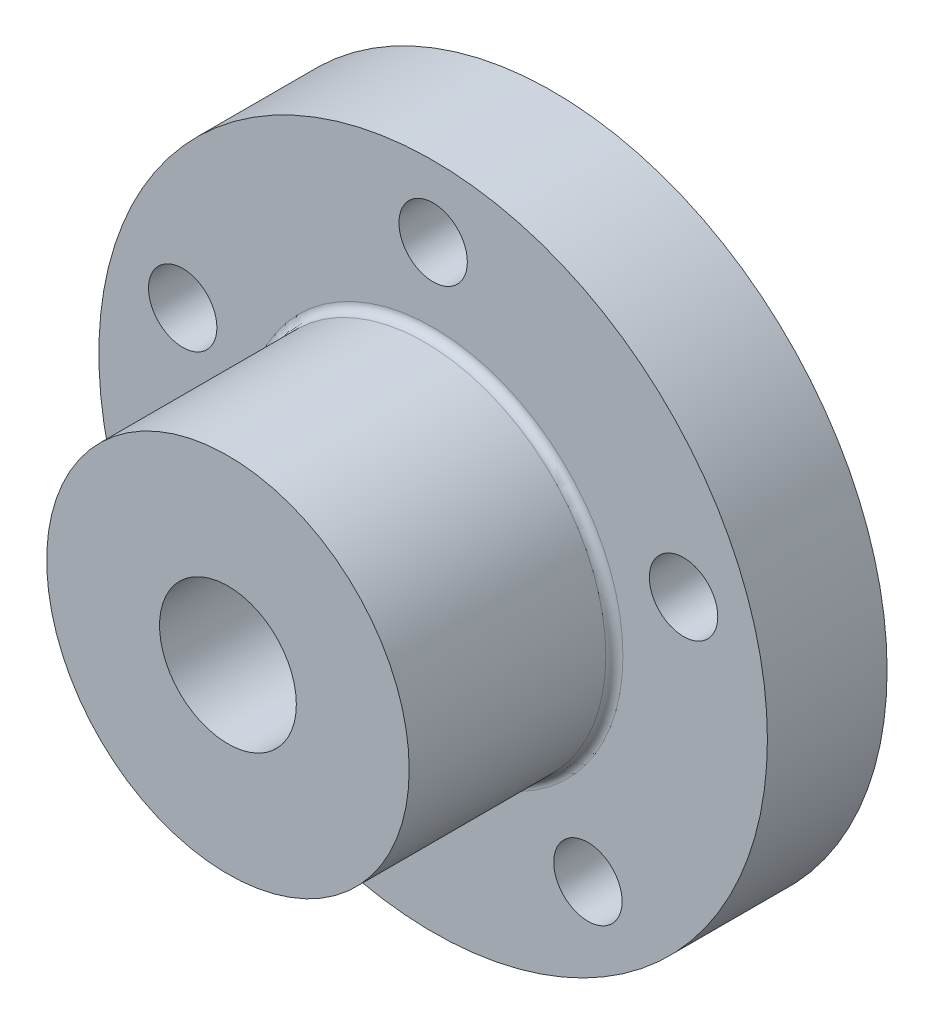
ISO-10303-21;
HEADER;
FILE_DESCRIPTION(('STEP AP214'),'2;1');
FILE_NAME('part.step','',(''),(''),'','','');
FILE_SCHEMA(('AUTOMOTIVE_DESIGN { 1 0 10303 214 1 1 1 1 }'));
ENDSEC;
DATA;
#1=APPLICATION_CONTEXT('core data for automotive mechanical design processes');
#2=APPLICATION_PROTOCOL_DEFINITION('international standard','automotive_design',2000,#1);
#3=PRODUCT_CONTEXT('',#1,'mechanical');
#4=PRODUCT('Part','Part','',(#3));
#5=PRODUCT_RELATED_PRODUCT_CATEGORY('part','',(#4));
#6=PRODUCT_DEFINITION_FORMATION('','',#4);
#7=PRODUCT_DEFINITION_CONTEXT('part definition',#1,'design');
#8=PRODUCT_DEFINITION('design','',#6,#7);
#9=PRODUCT_DEFINITION_SHAPE('','',#8);
#10=(LENGTH_UNIT() NAMED_UNIT(*) SI_UNIT(.MILLI.,.METRE.));
#11=(NAMED_UNIT(*) PLANE_ANGLE_UNIT() SI_UNIT($,.RADIAN.));
#12=(NAMED_UNIT(*) SI_UNIT($,.STERADIAN.) SOLID_ANGLE_UNIT());
#13=UNCERTAINTY_MEASURE_WITH_UNIT(LENGTH_MEASURE(1.E-05),#10,'distance_accuracy_value','');
#14=(GEOMETRIC_REPRESENTATION_CONTEXT(3) GLOBAL_UNCERTAINTY_ASSIGNED_CONTEXT((#13)) GLOBAL_UNIT_ASSIGNED_CONTEXT((#10,
#11,#12)) REPRESENTATION_CONTEXT('',''));
#15=CARTESIAN_POINT('',(0.,0.,0.));
#16=DIRECTION('',(0.,0.,1.));
#17=DIRECTION('',(1.,0.,0.));
#18=AXIS2_PLACEMENT_3D('',#15,#16,#17);
#19=CARTESIAN_POINT('',(0.,0.,7.));
#20=DIRECTION('',(0.,0.,1.));
#21=DIRECTION('',(1.,0.,0.));
#22=AXIS2_PLACEMENT_3D('',#19,#20,#21);
#23=PLANE('',#22);
#24=CARTESIAN_POINT('',(-14.6462703509452,4.75886171337398,7.));
#25=DIRECTION('',(0.,0.,1.));
#26=DIRECTION('',(1.,0.,0.));
#27=AXIS2_PLACEMENT_3D('',#24,#25,#26);
#28=CIRCLE('',#27,2.00000000000056);
#29=CARTESIAN_POINT('',(-12.6462703509446,4.75886171337398,7.));
#30=VERTEX_POINT('',#29);
#31=EDGE_CURVE('E84',#30,#30,#28,.T.);
#32=ORIENTED_EDGE('',*,*,#31,.F.);
#33=EDGE_LOOP('',(#32));
#34=FACE_BOUND('',#33,.T.);
#35=CARTESIAN_POINT('',(-9.05189288530368,-12.4588617133743,7.));
#36=DIRECTION('',(0.,0.,1.));
#37=DIRECTION('',(1.,0.,0.));
#38=AXIS2_PLACEMENT_3D('',#35,#36,#37);
#39=CIRCLE('',#38,2.00000000000056);
#40=CARTESIAN_POINT('',(-7.05189288530312,-12.4588617133743,7.));
#41=VERTEX_POINT('',#40);
#42=EDGE_CURVE('E78',#41,#41,#39,.T.);
#43=ORIENTED_EDGE('',*,*,#42,.F.);
#44=EDGE_LOOP('',(#43));
#45=FACE_BOUND('',#44,.T.);
#46=CARTESIAN_POINT('',(9.0518928853045,-12.4588617133741,7.));
#47=DIRECTION('',(0.,0.,1.));
#48=DIRECTION('',(1.,0.,0.));
#49=AXIS2_PLACEMENT_3D('',#46,#47,#48);
#50=CIRCLE('',#49,2.00000000000056);
#51=CARTESIAN_POINT('',(11.0518928853051,-12.4588617133741,7.));
#52=VERTEX_POINT('',#51);
#53=EDGE_CURVE('E72',#52,#52,#50,.T.);
#54=ORIENTED_EDGE('',*,*,#53,.F.);
#55=EDGE_LOOP('',(#54));
#56=FACE_BOUND('',#55,.T.);
#57=CARTESIAN_POINT('',(14.6462703509455,4.75886171337441,7.));
#58=DIRECTION('',(0.,0.,1.));
#59=DIRECTION('',(1.,0.,0.));
#60=AXIS2_PLACEMENT_3D('',#57,#58,#59);
#61=CIRCLE('',#60,2.00000000000057);
#62=CARTESIAN_POINT('',(16.6462703509461,4.75886171337441,7.));
#63=VERTEX_POINT('',#62);
#64=EDGE_CURVE('E66',#63,#63,#61,.T.);
#65=ORIENTED_EDGE('',*,*,#64,.F.);
#66=EDGE_LOOP('',(#65));
#67=FACE_BOUND('',#66,.T.);
#68=CARTESIAN_POINT('',(0.,15.4,7.));
#69=DIRECTION('',(0.,0.,1.));
#70=DIRECTION('',(1.,0.,0.));
#71=AXIS2_PLACEMENT_3D('',#68,#69,#70);
#72=CIRCLE('',#71,2.00000000000056);
#73=CARTESIAN_POINT('',(2.00000000000056,15.4,7.));
#74=VERTEX_POINT('',#73);
#75=EDGE_CURVE('E60',#74,#74,#72,.T.);
#76=ORIENTED_EDGE('',*,*,#75,.F.);
#77=EDGE_LOOP('',(#76));
#78=FACE_BOUND('',#77,.T.);
#79=CARTESIAN_POINT('',(0.,0.,7.));
#80=DIRECTION('',(0.,0.,1.));
#81=DIRECTION('',(1.,0.,0.));
#82=AXIS2_PLACEMENT_3D('',#79,#80,#81);
#83=CIRCLE('',#82,11.1);
#84=CARTESIAN_POINT('',(11.1,0.,7.));
#85=VERTEX_POINT('',#84);
#86=EDGE_CURVE('E10',#85,#85,#83,.F.);
#87=ORIENTED_EDGE('',*,*,#86,.T.);
#88=EDGE_LOOP('',(#87));
#89=FACE_BOUND('',#88,.T.);
#90=CARTESIAN_POINT('',(0.,0.,7.));
#91=DIRECTION('',(0.,0.,1.));
#92=DIRECTION('',(1.,0.,0.));
#93=AXIS2_PLACEMENT_3D('',#90,#91,#92);
#94=CIRCLE('',#93,19.55);
#95=CARTESIAN_POINT('',(19.55,0.,7.));
#96=VERTEX_POINT('',#95);
#97=EDGE_CURVE('E41',#96,#96,#94,.T.);
#98=ORIENTED_EDGE('',*,*,#97,.T.);
#99=EDGE_LOOP('',(#98));
#100=FACE_BOUND('',#99,.T.);
#101=ADVANCED_FACE('F30',(#34,#45,#56,#67,#78,#89,#100),#23,.T.);
#102=CARTESIAN_POINT('',(0.,0.,7.));
#103=DIRECTION('',(0.,0.,-1.));
#104=DIRECTION('',(-1.,0.,0.));
#105=AXIS2_PLACEMENT_3D('',#102,#103,#104);
#106=CYLINDRICAL_SURFACE('',#105,19.55);
#107=ORIENTED_EDGE('',*,*,#97,.F.);
#108=EDGE_LOOP('',(#107));
#109=FACE_BOUND('',#108,.T.);
#110=CARTESIAN_POINT('',(0.,0.,0.));
#111=DIRECTION('',(0.,0.,1.));
#112=DIRECTION('',(1.,0.,0.));
#113=AXIS2_PLACEMENT_3D('',#110,#111,#112);
#114=CIRCLE('',#113,19.55);
#115=CARTESIAN_POINT('',(19.55,0.,0.));
#116=VERTEX_POINT('',#115);
#117=EDGE_CURVE('E45',#116,#116,#114,.T.);
#118=ORIENTED_EDGE('',*,*,#117,.T.);
#119=EDGE_LOOP('',(#118));
#120=FACE_BOUND('',#119,.T.);
#121=ADVANCED_FACE('F102',(#109,#120),#106,.T.);
#122=CARTESIAN_POINT('',(0.,0.,0.));
#123=DIRECTION('',(0.,0.,1.));
#124=DIRECTION('',(1.,0.,0.));
#125=AXIS2_PLACEMENT_3D('',#122,#123,#124);
#126=PLANE('',#125);
#127=CARTESIAN_POINT('',(-14.6462703509452,4.75886171337398,0.));
#128=DIRECTION('',(0.,0.,1.));
#129=DIRECTION('',(1.,0.,0.));
#130=AXIS2_PLACEMENT_3D('',#127,#128,#129);
#131=CIRCLE('',#130,2.00000000000056);
#132=CARTESIAN_POINT('',(-12.6462703509446,4.75886171337398,0.));
#133=VERTEX_POINT('',#132);
#134=EDGE_CURVE('E81',#133,#133,#131,.T.);
#135=ORIENTED_EDGE('',*,*,#134,.T.);
#136=EDGE_LOOP('',(#135));
#137=FACE_BOUND('',#136,.T.);
#138=CARTESIAN_POINT('',(-9.05189288530368,-12.4588617133743,0.));
#139=DIRECTION('',(0.,0.,1.));
#140=DIRECTION('',(1.,0.,0.));
#141=AXIS2_PLACEMENT_3D('',#138,#139,#140);
#142=CIRCLE('',#141,2.00000000000056);
#143=CARTESIAN_POINT('',(-7.05189288530312,-12.4588617133743,0.));
#144=VERTEX_POINT('',#143);
#145=EDGE_CURVE('E75',#144,#144,#142,.T.);
#146=ORIENTED_EDGE('',*,*,#145,.T.);
#147=EDGE_LOOP('',(#146));
#148=FACE_BOUND('',#147,.T.);
#149=CARTESIAN_POINT('',(9.0518928853045,-12.4588617133741,0.));
#150=DIRECTION('',(0.,0.,1.));
#151=DIRECTION('',(1.,0.,0.));
#152=AXIS2_PLACEMENT_3D('',#149,#150,#151);
#153=CIRCLE('',#152,2.00000000000056);
#154=CARTESIAN_POINT('',(11.0518928853051,-12.4588617133741,0.));
#155=VERTEX_POINT('',#154);
#156=EDGE_CURVE('E69',#155,#155,#153,.T.);
#157=ORIENTED_EDGE('',*,*,#156,.T.);
#158=EDGE_LOOP('',(#157));
#159=FACE_BOUND('',#158,.T.);
#160=CARTESIAN_POINT('',(14.6462703509455,4.75886171337441,0.));
#161=DIRECTION('',(0.,0.,1.));
#162=DIRECTION('',(1.,0.,0.));
#163=AXIS2_PLACEMENT_3D('',#160,#161,#162);
#164=CIRCLE('',#163,2.00000000000057);
#165=CARTESIAN_POINT('',(16.6462703509461,4.75886171337441,0.));
#166=VERTEX_POINT('',#165);
#167=EDGE_CURVE('E63',#166,#166,#164,.T.);
#168=ORIENTED_EDGE('',*,*,#167,.T.);
#169=EDGE_LOOP('',(#168));
#170=FACE_BOUND('',#169,.T.);
#171=CARTESIAN_POINT('',(0.,15.4,0.));
#172=DIRECTION('',(0.,0.,1.));
#173=DIRECTION('',(1.,0.,0.));
#174=AXIS2_PLACEMENT_3D('',#171,#172,#173);
#175=CIRCLE('',#174,2.00000000000056);
#176=CARTESIAN_POINT('',(2.00000000000056,15.4,0.));
#177=VERTEX_POINT('',#176);
#178=EDGE_CURVE('E57',#177,#177,#175,.T.);
#179=ORIENTED_EDGE('',*,*,#178,.T.);
#180=EDGE_LOOP('',(#179));
#181=FACE_BOUND('',#180,.T.);
#182=CARTESIAN_POINT('',(0.,0.,0.));
#183=DIRECTION('',(0.,0.,1.));
#184=DIRECTION('',(1.,0.,0.));
#185=AXIS2_PLACEMENT_3D('',#182,#183,#184);
#186=CIRCLE('',#185,4.);
#187=CARTESIAN_POINT('',(4.,0.,0.));
#188=VERTEX_POINT('',#187);
#189=EDGE_CURVE('E53',#188,#188,#186,.T.);
#190=ORIENTED_EDGE('',*,*,#189,.T.);
#191=EDGE_LOOP('',(#190));
#192=FACE_BOUND('',#191,.T.);
#193=ORIENTED_EDGE('',*,*,#117,.F.);
#194=EDGE_LOOP('',(#193));
#195=FACE_BOUND('',#194,.T.);
#196=ADVANCED_FACE('F90',(#137,#148,#159,#170,#181,#192,#195),#126,.F.);
#197=CARTESIAN_POINT('',(0.,0.,19.));
#198=DIRECTION('',(0.,0.,-1.));
#199=DIRECTION('',(-1.,0.,0.));
#200=AXIS2_PLACEMENT_3D('',#197,#198,#199);
#201=CYLINDRICAL_SURFACE('',#200,10.6);
#202=CARTESIAN_POINT('',(0.,0.,7.5));
#203=DIRECTION('',(0.,0.,1.));
#204=DIRECTION('',(1.,0.,0.));
#205=AXIS2_PLACEMENT_3D('',#202,#203,#204);
#206=CIRCLE('',#205,10.6);
#207=CARTESIAN_POINT('',(10.6,0.,7.5));
#208=VERTEX_POINT('',#207);
#209=EDGE_CURVE('E37',#208,#208,#206,.T.);
#210=ORIENTED_EDGE('',*,*,#209,.T.);
#211=EDGE_LOOP('',(#210));
#212=FACE_BOUND('',#211,.T.);
#213=CARTESIAN_POINT('',(0.,0.,19.));
#214=DIRECTION('',(0.,0.,1.));
#215=DIRECTION('',(1.,0.,0.));
#216=AXIS2_PLACEMENT_3D('',#213,#214,#215);
#217=CIRCLE('',#216,10.6);
#218=CARTESIAN_POINT('',(10.6,0.,19.));
#219=VERTEX_POINT('',#218);
#220=EDGE_CURVE('E49',#219,#219,#217,.T.);
#221=ORIENTED_EDGE('',*,*,#220,.F.);
#222=EDGE_LOOP('',(#221));
#223=FACE_BOUND('',#222,.T.);
#224=ADVANCED_FACE('F119',(#212,#223),#201,.T.);
#225=CARTESIAN_POINT('',(0.,0.,19.));
#226=DIRECTION('',(0.,0.,1.));
#227=DIRECTION('',(1.,0.,0.));
#228=AXIS2_PLACEMENT_3D('',#225,#226,#227);
#229=PLANE('',#228);
#230=CARTESIAN_POINT('',(0.,0.,19.));
#231=DIRECTION('',(0.,0.,1.));
#232=DIRECTION('',(1.,0.,0.));
#233=AXIS2_PLACEMENT_3D('',#230,#231,#232);
#234=CIRCLE('',#233,4.);
#235=CARTESIAN_POINT('',(4.,0.,19.));
#236=VERTEX_POINT('',#235);
#237=EDGE_CURVE('E54',#236,#236,#234,.T.);
#238=ORIENTED_EDGE('',*,*,#237,.F.);
#239=EDGE_LOOP('',(#238));
#240=FACE_BOUND('',#239,.T.);
#241=ORIENTED_EDGE('',*,*,#220,.T.);
#242=EDGE_LOOP('',(#241));
#243=FACE_BOUND('',#242,.T.);
#244=ADVANCED_FACE('F124',(#240,#243),#229,.T.);
#245=CARTESIAN_POINT('',(0.,0.,7.5));
#246=DIRECTION('',(0.,0.,1.));
#247=DIRECTION('',(1.,0.,0.));
#248=AXIS2_PLACEMENT_3D('',#245,#246,#247);
#249=TOROIDAL_SURFACE('',#248,11.1,0.5);
#250=ORIENTED_EDGE('',*,*,#86,.F.);
#251=EDGE_LOOP('',(#250));
#252=FACE_BOUND('',#251,.T.);
#253=ORIENTED_EDGE('',*,*,#209,.F.);
#254=EDGE_LOOP('',(#253));
#255=FACE_BOUND('',#254,.T.);
#256=ADVANCED_FACE('F32',(#252,#255),#249,.F.);
#257=CARTESIAN_POINT('',(0.,0.,0.));
#258=DIRECTION('',(0.,0.,1.));
#259=DIRECTION('',(1.,0.,0.));
#260=AXIS2_PLACEMENT_3D('',#257,#258,#259);
#261=CYLINDRICAL_SURFACE('',#260,4.);
#262=ORIENTED_EDGE('',*,*,#189,.F.);
#263=EDGE_LOOP('',(#262));
#264=FACE_BOUND('',#263,.T.);
#265=ORIENTED_EDGE('',*,*,#237,.T.);
#266=EDGE_LOOP('',(#265));
#267=FACE_BOUND('',#266,.T.);
#268=ADVANCED_FACE('F130',(#264,#267),#261,.F.);
#269=CARTESIAN_POINT('',(0.,15.4,0.));
#270=DIRECTION('',(0.,0.,1.));
#271=DIRECTION('',(1.,0.,0.));
#272=AXIS2_PLACEMENT_3D('',#269,#270,#271);
#273=CYLINDRICAL_SURFACE('',#272,2.00000000000056);
#274=ORIENTED_EDGE('',*,*,#178,.F.);
#275=EDGE_LOOP('',(#274));
#276=FACE_BOUND('',#275,.T.);
#277=ORIENTED_EDGE('',*,*,#75,.T.);
#278=EDGE_LOOP('',(#277));
#279=FACE_BOUND('',#278,.T.);
#280=ADVANCED_FACE('F133',(#276,#279),#273,.F.);
#281=CARTESIAN_POINT('',(14.6462703509455,4.75886171337441,0.));
#282=DIRECTION('',(0.,0.,1.));
#283=DIRECTION('',(1.,0.,0.));
#284=AXIS2_PLACEMENT_3D('',#281,#282,#283);
#285=CYLINDRICAL_SURFACE('',#284,2.00000000000057);
#286=ORIENTED_EDGE('',*,*,#167,.F.);
#287=EDGE_LOOP('',(#286));
#288=FACE_BOUND('',#287,.T.);
#289=ORIENTED_EDGE('',*,*,#64,.T.);
#290=EDGE_LOOP('',(#289));
#291=FACE_BOUND('',#290,.T.);
#292=ADVANCED_FACE('F137',(#288,#291),#285,.F.);
#293=CARTESIAN_POINT('',(9.0518928853045,-12.4588617133741,0.));
#294=DIRECTION('',(0.,0.,1.));
#295=DIRECTION('',(1.,0.,0.));
#296=AXIS2_PLACEMENT_3D('',#293,#294,#295);
#297=CYLINDRICAL_SURFACE('',#296,2.00000000000056);
#298=ORIENTED_EDGE('',*,*,#156,.F.);
#299=EDGE_LOOP('',(#298));
#300=FACE_BOUND('',#299,.T.);
#301=ORIENTED_EDGE('',*,*,#53,.T.);
#302=EDGE_LOOP('',(#301));
#303=FACE_BOUND('',#302,.T.);
#304=ADVANCED_FACE('F141',(#300,#303),#297,.F.);
#305=CARTESIAN_POINT('',(-9.05189288530368,-12.4588617133743,0.));
#306=DIRECTION('',(0.,0.,1.));
#307=DIRECTION('',(1.,0.,0.));
#308=AXIS2_PLACEMENT_3D('',#305,#306,#307);
#309=CYLINDRICAL_SURFACE('',#308,2.00000000000056);
#310=ORIENTED_EDGE('',*,*,#145,.F.);
#311=EDGE_LOOP('',(#310));
#312=FACE_BOUND('',#311,.T.);
#313=ORIENTED_EDGE('',*,*,#42,.T.);
#314=EDGE_LOOP('',(#313));
#315=FACE_BOUND('',#314,.T.);
#316=ADVANCED_FACE('F96',(#312,#315),#309,.F.);
#317=CARTESIAN_POINT('',(-14.6462703509452,4.75886171337398,0.));
#318=DIRECTION('',(0.,0.,1.));
#319=DIRECTION('',(1.,0.,0.));
#320=AXIS2_PLACEMENT_3D('',#317,#318,#319);
#321=CYLINDRICAL_SURFACE('',#320,2.00000000000056);
#322=ORIENTED_EDGE('',*,*,#134,.F.);
#323=EDGE_LOOP('',(#322));
#324=FACE_BOUND('',#323,.T.);
#325=ORIENTED_EDGE('',*,*,#31,.T.);
#326=EDGE_LOOP('',(#325));
#327=FACE_BOUND('',#326,.T.);
#328=ADVANCED_FACE('F93',(#324,#327),#321,.F.);
#329=CLOSED_SHELL('',(#101,#121,#196,#224,#244,#256,#268,#280,#292,#304,#316,#328));
#330=MANIFOLD_SOLID_BREP('B2',#329);
#331=ADVANCED_BREP_SHAPE_REPRESENTATION('',(#18,#330),#14);
#332=SHAPE_DEFINITION_REPRESENTATION(#9,#331);
ENDSEC;
END-ISO-10303-21;
